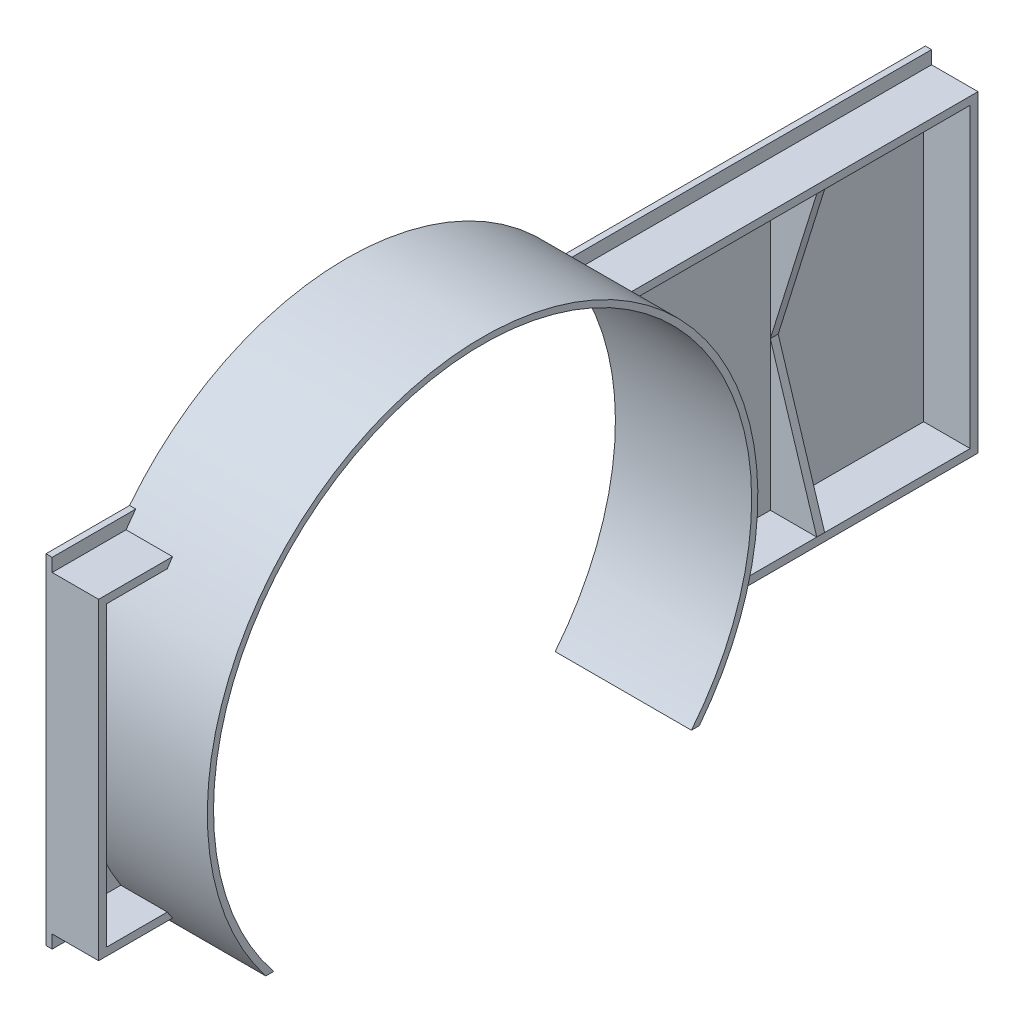
ISO-10303-21;
HEADER;
FILE_DESCRIPTION(('STEP AP214'),'2;1');
FILE_NAME('part.step','',(''),(''),'','','');
FILE_SCHEMA(('AUTOMOTIVE_DESIGN { 1 0 10303 214 1 1 1 1 }'));
ENDSEC;
DATA;
#1=APPLICATION_CONTEXT('core data for automotive mechanical design processes');
#2=APPLICATION_PROTOCOL_DEFINITION('international standard','automotive_design',2000,#1);
#3=PRODUCT_CONTEXT('',#1,'mechanical');
#4=PRODUCT('Part','Part','',(#3));
#5=PRODUCT_RELATED_PRODUCT_CATEGORY('part','',(#4));
#6=PRODUCT_DEFINITION_FORMATION('','',#4);
#7=PRODUCT_DEFINITION_CONTEXT('part definition',#1,'design');
#8=PRODUCT_DEFINITION('design','',#6,#7);
#9=PRODUCT_DEFINITION_SHAPE('','',#8);
#10=(LENGTH_UNIT() NAMED_UNIT(*) SI_UNIT(.MILLI.,.METRE.));
#11=(NAMED_UNIT(*) PLANE_ANGLE_UNIT() SI_UNIT($,.RADIAN.));
#12=(NAMED_UNIT(*) SI_UNIT($,.STERADIAN.) SOLID_ANGLE_UNIT());
#13=UNCERTAINTY_MEASURE_WITH_UNIT(LENGTH_MEASURE(1.E-05),#10,'distance_accuracy_value','');
#14=(GEOMETRIC_REPRESENTATION_CONTEXT(3) GLOBAL_UNCERTAINTY_ASSIGNED_CONTEXT((#13)) GLOBAL_UNIT_ASSIGNED_CONTEXT((#10,
#11,#12)) REPRESENTATION_CONTEXT('',''));
#15=CARTESIAN_POINT('',(0.,0.,0.));
#16=DIRECTION('',(0.,0.,1.));
#17=DIRECTION('',(1.,0.,0.));
#18=AXIS2_PLACEMENT_3D('',#15,#16,#17);
#19=CARTESIAN_POINT('',(0.,0.,0.));
#20=DIRECTION('',(1.,0.,0.));
#21=DIRECTION('',(0.,0.,-1.));
#22=AXIS2_PLACEMENT_3D('',#19,#20,#21);
#23=PLANE('',#22);
#24=DIRECTION('',(0.,0.,-1.));
#25=VECTOR('',#24,1.);
#26=CARTESIAN_POINT('',(0.,102.81000012,122.000000064));
#27=LINE('',#26,#25);
#28=CARTESIAN_POINT('',(0.,102.81000012,119.460000064));
#29=VERTEX_POINT('',#28);
#30=CARTESIAN_POINT('',(0.,102.81000012,99.8214533972538));
#31=VERTEX_POINT('',#30);
#32=EDGE_CURVE('E462',#29,#31,#27,.T.);
#33=ORIENTED_EDGE('',*,*,#32,.F.);
#34=DIRECTION('',(0.,1.,0.));
#35=VECTOR('',#34,1.);
#36=CARTESIAN_POINT('',(0.,102.81000012,119.460000064));
#37=LINE('',#36,#35);
#38=CARTESIAN_POINT('',(0.,6.78999988200613,119.460000064));
#39=VERTEX_POINT('',#38);
#40=EDGE_CURVE('E247',#39,#29,#37,.T.);
#41=ORIENTED_EDGE('',*,*,#40,.F.);
#42=DIRECTION('',(0.,0.,1.));
#43=VECTOR('',#42,1.);
#44=CARTESIAN_POINT('',(0.,6.789999882,99.8214533985529));
#45=LINE('',#44,#43);
#46=CARTESIAN_POINT('',(0.,6.789999882,99.8214533985395));
#47=VERTEX_POINT('',#46);
#48=EDGE_CURVE('E256',#47,#39,#45,.T.);
#49=ORIENTED_EDGE('',*,*,#48,.F.);
#50=CARTESIAN_POINT('',(0.,54.7999999999982,25.));
#51=DIRECTION('',(-1.,0.,0.));
#52=DIRECTION('',(0.,0.,-1.));
#53=AXIS2_PLACEMENT_3D('',#50,#51,#52);
#54=CIRCLE('',#53,88.9);
#55=EDGE_CURVE('E375',#47,#31,#54,.T.);
#56=ORIENTED_EDGE('',*,*,#55,.T.);
#57=EDGE_LOOP('',(#33,#41,#49,#56));
#58=FACE_BOUND('',#57,.T.);
#59=ADVANCED_FACE('F37',(#58),#23,.T.);
#60=CARTESIAN_POINT('',(15.,6.789999882,99.8214533985529));
#61=DIRECTION('',(0.,-1.,0.));
#62=DIRECTION('',(0.,0.,-1.));
#63=AXIS2_PLACEMENT_3D('',#60,#61,#62);
#64=PLANE('',#63);
#65=DIRECTION('',(-1.,0.,0.));
#66=VECTOR('',#65,1.);
#67=CARTESIAN_POINT('',(15.,6.78999988200613,119.460000064));
#68=LINE('',#67,#66);
#69=CARTESIAN_POINT('',(15.,6.78999988200613,119.460000064));
#70=VERTEX_POINT('',#69);
#71=EDGE_CURVE('E242',#70,#39,#68,.T.);
#72=ORIENTED_EDGE('',*,*,#71,.F.);
#73=DIRECTION('',(0.,0.,1.));
#74=VECTOR('',#73,1.);
#75=CARTESIAN_POINT('',(15.,6.789999882,99.8214533985529));
#76=LINE('',#75,#74);
#77=CARTESIAN_POINT('',(15.,6.78999988200613,99.8214533985434));
#78=VERTEX_POINT('',#77);
#79=EDGE_CURVE('E254',#78,#70,#76,.T.);
#80=ORIENTED_EDGE('',*,*,#79,.F.);
#81=DIRECTION('',(-1.,0.,0.));
#82=VECTOR('',#81,1.);
#83=CARTESIAN_POINT('',(15.,6.789999882,99.8214533985529));
#84=LINE('',#83,#82);
#85=EDGE_CURVE('E280',#78,#47,#84,.T.);
#86=ORIENTED_EDGE('',*,*,#85,.T.);
#87=ORIENTED_EDGE('',*,*,#48,.T.);
#88=EDGE_LOOP('',(#72,#80,#86,#87));
#89=FACE_BOUND('',#88,.T.);
#90=ADVANCED_FACE('F252',(#89),#64,.F.);
#91=CARTESIAN_POINT('',(15.,102.81000012,122.000000064));
#92=DIRECTION('',(0.,1.,0.));
#93=DIRECTION('',(0.,0.,1.));
#94=AXIS2_PLACEMENT_3D('',#91,#92,#93);
#95=PLANE('',#94);
#96=DIRECTION('',(-1.,0.,0.));
#97=VECTOR('',#96,1.);
#98=CARTESIAN_POINT('',(15.,102.81000012,119.460000064));
#99=LINE('',#98,#97);
#100=CARTESIAN_POINT('',(15.,102.81000012,119.460000064));
#101=VERTEX_POINT('',#100);
#102=EDGE_CURVE('E54',#101,#29,#99,.T.);
#103=ORIENTED_EDGE('',*,*,#102,.T.);
#104=ORIENTED_EDGE('',*,*,#32,.T.);
#105=DIRECTION('',(-1.,0.,0.));
#106=VECTOR('',#105,1.);
#107=CARTESIAN_POINT('',(15.,102.81000012,99.8214533972538));
#108=LINE('',#107,#106);
#109=CARTESIAN_POINT('',(15.,102.81000012,99.8214533972538));
#110=VERTEX_POINT('',#109);
#111=EDGE_CURVE('E273',#110,#31,#108,.T.);
#112=ORIENTED_EDGE('',*,*,#111,.F.);
#113=DIRECTION('',(0.,0.,-1.));
#114=VECTOR('',#113,1.);
#115=CARTESIAN_POINT('',(15.,102.81000012,122.000000064));
#116=LINE('',#115,#114);
#117=EDGE_CURVE('E488',#101,#110,#116,.T.);
#118=ORIENTED_EDGE('',*,*,#117,.F.);
#119=EDGE_LOOP('',(#103,#104,#112,#118));
#120=FACE_BOUND('',#119,.T.);
#121=ADVANCED_FACE('F490',(#120),#95,.F.);
#122=DIRECTION('',(0.,0.,1.));
#123=VECTOR('',#122,1.);
#124=CARTESIAN_POINT('',(0.,6.789999882,-49.8214533985395));
#125=LINE('',#124,#123);
#126=CARTESIAN_POINT('',(0.,6.789999882,-159.460000064));
#127=VERTEX_POINT('',#126);
#128=CARTESIAN_POINT('',(0.,6.789999882,-112.470000064));
#129=VERTEX_POINT('',#128);
#130=EDGE_CURVE('E287',#127,#129,#125,.T.);
#131=ORIENTED_EDGE('',*,*,#130,.F.);
#132=DIRECTION('',(0.,-1.,0.));
#133=VECTOR('',#132,1.);
#134=CARTESIAN_POINT('',(0.,102.81000012,-159.460000064));
#135=LINE('',#134,#133);
#136=CARTESIAN_POINT('',(0.,102.81000012,-159.460000064));
#137=VERTEX_POINT('',#136);
#138=EDGE_CURVE('E257',#137,#127,#135,.T.);
#139=ORIENTED_EDGE('',*,*,#138,.F.);
#140=DIRECTION('',(0.,0.,-1.));
#141=VECTOR('',#140,1.);
#142=CARTESIAN_POINT('',(0.,102.81000012,-162.000000064));
#143=LINE('',#142,#141);
#144=CARTESIAN_POINT('',(0.,102.81000012,-112.470000064));
#145=VERTEX_POINT('',#144);
#146=EDGE_CURVE('E545',#145,#137,#143,.T.);
#147=ORIENTED_EDGE('',*,*,#146,.F.);
#148=DIRECTION('',(0.,1.,0.));
#149=VECTOR('',#148,1.);
#150=CARTESIAN_POINT('',(0.,0.,-112.470000064));
#151=LINE('',#150,#149);
#152=CARTESIAN_POINT('',(0.,54.800000001,-112.470000064));
#153=VERTEX_POINT('',#152);
#154=EDGE_CURVE('E535',#153,#145,#151,.T.);
#155=ORIENTED_EDGE('',*,*,#154,.F.);
#156=DIRECTION('',(0.,1.,0.));
#157=VECTOR('',#156,1.);
#158=CARTESIAN_POINT('',(0.,0.,-112.470000064));
#159=LINE('',#158,#157);
#160=EDGE_CURVE('E515',#129,#153,#159,.T.);
#161=ORIENTED_EDGE('',*,*,#160,.F.);
#162=EDGE_LOOP('',(#131,#139,#147,#155,#161));
#163=FACE_BOUND('',#162,.T.);
#164=ADVANCED_FACE('F560',(#163),#23,.T.);
#165=CARTESIAN_POINT('',(15.,6.789999882,-49.8214533985395));
#166=DIRECTION('',(0.,-1.,0.));
#167=DIRECTION('',(0.,0.,-1.));
#168=AXIS2_PLACEMENT_3D('',#165,#166,#167);
#169=PLANE('',#168);
#170=DIRECTION('',(-1.,0.,0.));
#171=VECTOR('',#170,1.);
#172=CARTESIAN_POINT('',(15.,6.789999882,-159.460000064));
#173=LINE('',#172,#171);
#174=CARTESIAN_POINT('',(15.,6.789999882,-159.460000064));
#175=VERTEX_POINT('',#174);
#176=EDGE_CURVE('E496',#175,#127,#173,.T.);
#177=ORIENTED_EDGE('',*,*,#176,.T.);
#178=ORIENTED_EDGE('',*,*,#130,.T.);
#179=DIRECTION('',(1.,0.,0.));
#180=VECTOR('',#179,1.);
#181=CARTESIAN_POINT('',(15.,6.789999882,-112.470000064));
#182=LINE('',#181,#180);
#183=CARTESIAN_POINT('',(15.,6.789999882,-112.470000064));
#184=VERTEX_POINT('',#183);
#185=EDGE_CURVE('E512',#129,#184,#182,.T.);
#186=ORIENTED_EDGE('',*,*,#185,.T.);
#187=DIRECTION('',(0.,0.,1.));
#188=VECTOR('',#187,1.);
#189=CARTESIAN_POINT('',(15.,6.789999882,-49.8214533985395));
#190=LINE('',#189,#188);
#191=EDGE_CURVE('E292',#175,#184,#190,.T.);
#192=ORIENTED_EDGE('',*,*,#191,.F.);
#193=EDGE_LOOP('',(#177,#178,#186,#192));
#194=FACE_BOUND('',#193,.T.);
#195=ADVANCED_FACE('F567',(#194),#169,.F.);
#196=CARTESIAN_POINT('',(15.,102.81000012,-162.000000064));
#197=DIRECTION('',(0.,1.,0.));
#198=DIRECTION('',(0.,0.,1.));
#199=AXIS2_PLACEMENT_3D('',#196,#197,#198);
#200=PLANE('',#199);
#201=DIRECTION('',(-1.,0.,0.));
#202=VECTOR('',#201,1.);
#203=CARTESIAN_POINT('',(15.,102.81000012,-159.460000064));
#204=LINE('',#203,#202);
#205=CARTESIAN_POINT('',(15.,102.81000012,-159.460000064));
#206=VERTEX_POINT('',#205);
#207=EDGE_CURVE('E500',#206,#137,#204,.T.);
#208=ORIENTED_EDGE('',*,*,#207,.F.);
#209=DIRECTION('',(0.,0.,-1.));
#210=VECTOR('',#209,1.);
#211=CARTESIAN_POINT('',(15.,102.81000012,-162.000000064));
#212=LINE('',#211,#210);
#213=CARTESIAN_POINT('',(15.,102.81000012,-112.470000064));
#214=VERTEX_POINT('',#213);
#215=EDGE_CURVE('E541',#214,#206,#212,.T.);
#216=ORIENTED_EDGE('',*,*,#215,.F.);
#217=DIRECTION('',(-1.,0.,0.));
#218=VECTOR('',#217,1.);
#219=CARTESIAN_POINT('',(15.,102.81000012,-112.470000064));
#220=LINE('',#219,#218);
#221=EDGE_CURVE('E532',#214,#145,#220,.T.);
#222=ORIENTED_EDGE('',*,*,#221,.T.);
#223=ORIENTED_EDGE('',*,*,#146,.T.);
#224=EDGE_LOOP('',(#208,#216,#222,#223));
#225=FACE_BOUND('',#224,.T.);
#226=ADVANCED_FACE('F553',(#225),#200,.F.);
#227=CARTESIAN_POINT('',(0.,6.789999882,-109.930000064));
#228=VERTEX_POINT('',#227);
#229=CARTESIAN_POINT('',(0.,6.789999882,-49.8214533985395));
#230=VERTEX_POINT('',#229);
#231=EDGE_CURVE('E296',#228,#230,#125,.T.);
#232=ORIENTED_EDGE('',*,*,#231,.F.);
#233=DIRECTION('',(0.,1.,0.));
#234=VECTOR('',#233,1.);
#235=CARTESIAN_POINT('',(0.,0.,-109.930000064));
#236=LINE('',#235,#234);
#237=CARTESIAN_POINT('',(0.,54.8000000010001,-109.930000064));
#238=VERTEX_POINT('',#237);
#239=EDGE_CURVE('E509',#228,#238,#236,.T.);
#240=ORIENTED_EDGE('',*,*,#239,.T.);
#241=DIRECTION('',(0.,1.,0.));
#242=VECTOR('',#241,1.);
#243=CARTESIAN_POINT('',(0.,0.,-109.930000064));
#244=LINE('',#243,#242);
#245=CARTESIAN_POINT('',(0.,102.81000012,-109.930000064));
#246=VERTEX_POINT('',#245);
#247=EDGE_CURVE('E529',#238,#246,#244,.T.);
#248=ORIENTED_EDGE('',*,*,#247,.T.);
#249=CARTESIAN_POINT('',(0.,102.81000012,-49.8214533972539));
#250=VERTEX_POINT('',#249);
#251=EDGE_CURVE('E539',#250,#246,#143,.T.);
#252=ORIENTED_EDGE('',*,*,#251,.F.);
#253=EDGE_CURVE('E376',#250,#230,#54,.T.);
#254=ORIENTED_EDGE('',*,*,#253,.T.);
#255=EDGE_LOOP('',(#232,#240,#248,#252,#254));
#256=FACE_BOUND('',#255,.T.);
#257=ADVANCED_FACE('F589',(#256),#23,.T.);
#258=DIRECTION('',(1.,0.,0.));
#259=VECTOR('',#258,1.);
#260=CARTESIAN_POINT('',(15.,6.789999882,-109.930000064));
#261=LINE('',#260,#259);
#262=CARTESIAN_POINT('',(15.,6.789999882,-109.930000064));
#263=VERTEX_POINT('',#262);
#264=EDGE_CURVE('E505',#228,#263,#261,.T.);
#265=ORIENTED_EDGE('',*,*,#264,.F.);
#266=ORIENTED_EDGE('',*,*,#231,.T.);
#267=DIRECTION('',(-1.,0.,0.));
#268=VECTOR('',#267,1.);
#269=CARTESIAN_POINT('',(15.,6.789999882,-49.8214533985395));
#270=LINE('',#269,#268);
#271=CARTESIAN_POINT('',(15.,6.789999882,-49.8214533985395));
#272=VERTEX_POINT('',#271);
#273=EDGE_CURVE('E294',#272,#230,#270,.T.);
#274=ORIENTED_EDGE('',*,*,#273,.F.);
#275=EDGE_CURVE('E291',#263,#272,#190,.T.);
#276=ORIENTED_EDGE('',*,*,#275,.F.);
#277=EDGE_LOOP('',(#265,#266,#274,#276));
#278=FACE_BOUND('',#277,.T.);
#279=ADVANCED_FACE('F606',(#278),#169,.F.);
#280=DIRECTION('',(-1.,0.,0.));
#281=VECTOR('',#280,1.);
#282=CARTESIAN_POINT('',(15.,102.81000012,-109.930000064));
#283=LINE('',#282,#281);
#284=CARTESIAN_POINT('',(15.,102.81000012,-109.930000064));
#285=VERTEX_POINT('',#284);
#286=EDGE_CURVE('E527',#285,#246,#283,.T.);
#287=ORIENTED_EDGE('',*,*,#286,.F.);
#288=CARTESIAN_POINT('',(15.,102.81000012,-49.8214533972539));
#289=VERTEX_POINT('',#288);
#290=EDGE_CURVE('E484',#289,#285,#212,.T.);
#291=ORIENTED_EDGE('',*,*,#290,.F.);
#292=DIRECTION('',(-1.,0.,0.));
#293=VECTOR('',#292,1.);
#294=CARTESIAN_POINT('',(15.,102.81000012,-49.8214533972539));
#295=LINE('',#294,#293);
#296=EDGE_CURVE('E480',#289,#250,#295,.T.);
#297=ORIENTED_EDGE('',*,*,#296,.T.);
#298=ORIENTED_EDGE('',*,*,#251,.T.);
#299=EDGE_LOOP('',(#287,#291,#297,#298));
#300=FACE_BOUND('',#299,.T.);
#301=ADVANCED_FACE('F593',(#300),#200,.F.);
#302=CARTESIAN_POINT('',(42.000000074,54.7999999999982,25.));
#303=DIRECTION('',(-1.,0.,0.));
#304=DIRECTION('',(0.,0.,1.));
#305=AXIS2_PLACEMENT_3D('',#302,#303,#304);
#306=CYLINDRICAL_SURFACE('',#305,88.9);
#307=CARTESIAN_POINT('',(15.,54.7999999999982,25.));
#308=DIRECTION('',(-1.,0.,0.));
#309=DIRECTION('',(0.,0.,1.));
#310=AXIS2_PLACEMENT_3D('',#307,#308,#309);
#311=CIRCLE('',#310,88.9);
#312=CARTESIAN_POINT('',(15.,105.35000012,-48.1293886742383));
#313=VERTEX_POINT('',#312);
#314=EDGE_CURVE('E476',#313,#289,#311,.T.);
#315=ORIENTED_EDGE('',*,*,#314,.F.);
#316=DIRECTION('',(-1.,0.,0.));
#317=VECTOR('',#316,1.);
#318=CARTESIAN_POINT('',(15.,105.35000012,-48.1293886742384));
#319=LINE('',#318,#317);
#320=CARTESIAN_POINT('',(0.,105.35000012,-48.1293886742384));
#321=VERTEX_POINT('',#320);
#322=EDGE_CURVE('E474',#313,#321,#319,.T.);
#323=ORIENTED_EDGE('',*,*,#322,.T.);
#324=CARTESIAN_POINT('',(0.,109.600000002,-45.0012142736153));
#325=VERTEX_POINT('',#324);
#326=EDGE_CURVE('E377',#325,#321,#54,.T.);
#327=ORIENTED_EDGE('',*,*,#326,.F.);
#328=DIRECTION('',(1.,0.,0.));
#329=VECTOR('',#328,1.);
#330=CARTESIAN_POINT('',(-2.000000064,109.60000000162,-45.0012142746965));
#331=LINE('',#330,#329);
#332=CARTESIAN_POINT('',(-2.000000064,109.60000000162,-45.0012142746965));
#333=VERTEX_POINT('',#332);
#334=EDGE_CURVE('E344',#333,#325,#331,.T.);
#335=ORIENTED_EDGE('',*,*,#334,.F.);
#336=CARTESIAN_POINT('',(-2.000000064,54.7999999999982,25.));
#337=DIRECTION('',(1.,0.,0.));
#338=DIRECTION('',(0.,0.,-1.));
#339=AXIS2_PLACEMENT_3D('',#336,#337,#338);
#340=CIRCLE('',#339,88.9);
#341=CARTESIAN_POINT('',(-2.000000064,109.599999999998,95.0012142751822));
#342=VERTEX_POINT('',#341);
#343=EDGE_CURVE('E306',#333,#342,#340,.T.);
#344=ORIENTED_EDGE('',*,*,#343,.T.);
#345=DIRECTION('',(1.,0.,0.));
#346=VECTOR('',#345,1.);
#347=CARTESIAN_POINT('',(-2.000000064,109.599999999998,95.0012142751822));
#348=LINE('',#347,#346);
#349=CARTESIAN_POINT('',(0.,109.599999999998,95.0012142751821));
#350=VERTEX_POINT('',#349);
#351=EDGE_CURVE('E328',#342,#350,#348,.T.);
#352=ORIENTED_EDGE('',*,*,#351,.T.);
#353=CARTESIAN_POINT('',(0.,105.35000012,98.1293886742383));
#354=VERTEX_POINT('',#353);
#355=EDGE_CURVE('E408',#354,#350,#54,.T.);
#356=ORIENTED_EDGE('',*,*,#355,.F.);
#357=DIRECTION('',(-1.,0.,0.));
#358=VECTOR('',#357,1.);
#359=CARTESIAN_POINT('',(15.,105.35000012,98.1293886742383));
#360=LINE('',#359,#358);
#361=CARTESIAN_POINT('',(15.,105.35000012,98.1293886742383));
#362=VERTEX_POINT('',#361);
#363=EDGE_CURVE('E450',#362,#354,#360,.T.);
#364=ORIENTED_EDGE('',*,*,#363,.F.);
#365=CARTESIAN_POINT('',(15.,54.7999999999982,25.));
#366=DIRECTION('',(-1.,0.,0.));
#367=DIRECTION('',(0.,0.,-1.));
#368=AXIS2_PLACEMENT_3D('',#365,#366,#367);
#369=CIRCLE('',#368,88.9);
#370=EDGE_CURVE('E443',#110,#362,#369,.T.);
#371=ORIENTED_EDGE('',*,*,#370,.F.);
#372=ORIENTED_EDGE('',*,*,#111,.T.);
#373=ORIENTED_EDGE('',*,*,#55,.F.);
#374=ORIENTED_EDGE('',*,*,#85,.F.);
#375=CARTESIAN_POINT('',(15.,54.8000000109421,24.9999999841677));
#376=DIRECTION('',(-1.,0.,0.));
#377=DIRECTION('',(0.,0.,-1.));
#378=AXIS2_PLACEMENT_3D('',#375,#376,#377);
#379=CIRCLE('',#378,88.9000000192466);
#380=CARTESIAN_POINT('',(15.,4.249999882,98.1293886756233));
#381=VERTEX_POINT('',#380);
#382=EDGE_CURVE('E261',#381,#78,#379,.T.);
#383=ORIENTED_EDGE('',*,*,#382,.F.);
#384=DIRECTION('',(-1.,0.,0.));
#385=VECTOR('',#384,1.);
#386=CARTESIAN_POINT('',(15.,4.249999882,98.1293886756233));
#387=LINE('',#386,#385);
#388=CARTESIAN_POINT('',(0.,4.249999882,98.1293886756233));
#389=VERTEX_POINT('',#388);
#390=EDGE_CURVE('E271',#381,#389,#387,.T.);
#391=ORIENTED_EDGE('',*,*,#390,.T.);
#392=CARTESIAN_POINT('',(0.,0.,95.0012142751838));
#393=VERTEX_POINT('',#392);
#394=EDGE_CURVE('E365',#393,#389,#54,.T.);
#395=ORIENTED_EDGE('',*,*,#394,.F.);
#396=DIRECTION('',(-1.,0.,0.));
#397=VECTOR('',#396,1.);
#398=CARTESIAN_POINT('',(42.000000074,0.,95.0012142751838));
#399=LINE('',#398,#397);
#400=CARTESIAN_POINT('',(42.000000074,0.,95.0012142751838));
#401=VERTEX_POINT('',#400);
#402=EDGE_CURVE('E380',#401,#393,#399,.T.);
#403=ORIENTED_EDGE('',*,*,#402,.F.);
#404=CARTESIAN_POINT('',(42.000000074,54.7999999999982,25.));
#405=DIRECTION('',(-1.,0.,0.));
#406=DIRECTION('',(0.,0.,-1.));
#407=AXIS2_PLACEMENT_3D('',#404,#405,#406);
#408=CIRCLE('',#407,88.9);
#409=CARTESIAN_POINT('',(42.000000074,0.,-45.0012142751838));
#410=VERTEX_POINT('',#409);
#411=EDGE_CURVE('E368',#401,#410,#408,.T.);
#412=ORIENTED_EDGE('',*,*,#411,.T.);
#413=DIRECTION('',(-1.,0.,0.));
#414=VECTOR('',#413,1.);
#415=CARTESIAN_POINT('',(42.000000074,0.,-45.0012142751838));
#416=LINE('',#415,#414);
#417=CARTESIAN_POINT('',(0.,0.,-45.0012142751838));
#418=VERTEX_POINT('',#417);
#419=EDGE_CURVE('E46',#410,#418,#416,.T.);
#420=ORIENTED_EDGE('',*,*,#419,.T.);
#421=CARTESIAN_POINT('',(0.,4.249999882,-48.1293886756233));
#422=VERTEX_POINT('',#421);
#423=EDGE_CURVE('E347',#422,#418,#54,.T.);
#424=ORIENTED_EDGE('',*,*,#423,.F.);
#425=DIRECTION('',(-1.,0.,0.));
#426=VECTOR('',#425,1.);
#427=CARTESIAN_POINT('',(15.,4.249999882,-48.1293886756233));
#428=LINE('',#427,#426);
#429=CARTESIAN_POINT('',(15.,4.249999882,-48.1293886756233));
#430=VERTEX_POINT('',#429);
#431=EDGE_CURVE('E303',#430,#422,#428,.T.);
#432=ORIENTED_EDGE('',*,*,#431,.F.);
#433=CARTESIAN_POINT('',(15.,54.7999999999982,25.));
#434=DIRECTION('',(-1.,0.,0.));
#435=DIRECTION('',(0.,0.,1.));
#436=AXIS2_PLACEMENT_3D('',#433,#434,#435);
#437=CIRCLE('',#436,88.9);
#438=EDGE_CURVE('E283',#272,#430,#437,.T.);
#439=ORIENTED_EDGE('',*,*,#438,.F.);
#440=ORIENTED_EDGE('',*,*,#273,.T.);
#441=ORIENTED_EDGE('',*,*,#253,.F.);
#442=ORIENTED_EDGE('',*,*,#296,.F.);
#443=EDGE_LOOP('',(#315,#323,#327,#335,#344,#352,#356,#364,#371,#372,#373,#374,#383,#391,#395,
#403,#412,#420,#424,#432,#439,#440,#441,#442));
#444=FACE_BOUND('',#443,.T.);
#445=ADVANCED_FACE('F407',(#444),#306,.T.);
#446=DIRECTION('',(0.,0.,1.));
#447=VECTOR('',#446,1.);
#448=CARTESIAN_POINT('',(0.,109.600000002,0.));
#449=LINE('',#448,#447);
#450=CARTESIAN_POINT('',(0.,109.600000002,-162.000000064));
#451=VERTEX_POINT('',#450);
#452=EDGE_CURVE('E310',#451,#325,#449,.T.);
#453=ORIENTED_EDGE('',*,*,#452,.T.);
#454=ORIENTED_EDGE('',*,*,#326,.T.);
#455=DIRECTION('',(0.,0.,1.));
#456=VECTOR('',#455,1.);
#457=CARTESIAN_POINT('',(0.,105.35000012,-162.000000064));
#458=LINE('',#457,#456);
#459=CARTESIAN_POINT('',(0.,105.35000012,-162.000000064));
#460=VERTEX_POINT('',#459);
#461=EDGE_CURVE('E470',#460,#321,#458,.T.);
#462=ORIENTED_EDGE('',*,*,#461,.F.);
#463=DIRECTION('',(0.,1.,0.));
#464=VECTOR('',#463,1.);
#465=CARTESIAN_POINT('',(0.,0.,-162.000000064));
#466=LINE('',#465,#464);
#467=EDGE_CURVE('E339',#460,#451,#466,.T.);
#468=ORIENTED_EDGE('',*,*,#467,.T.);
#469=EDGE_LOOP('',(#453,#454,#462,#468));
#470=FACE_BOUND('',#469,.T.);
#471=ADVANCED_FACE('F469',(#470),#23,.T.);
#472=DIRECTION('',(0.,-1.,0.));
#473=VECTOR('',#472,1.);
#474=CARTESIAN_POINT('',(0.,0.,122.000000064));
#475=LINE('',#474,#473);
#476=CARTESIAN_POINT('',(0.,109.599999999999,122.000000064));
#477=VERTEX_POINT('',#476);
#478=CARTESIAN_POINT('',(0.,105.35000012,122.000000064));
#479=VERTEX_POINT('',#478);
#480=EDGE_CURVE('E332',#477,#479,#475,.T.);
#481=ORIENTED_EDGE('',*,*,#480,.T.);
#482=DIRECTION('',(0.,0.,1.));
#483=VECTOR('',#482,1.);
#484=CARTESIAN_POINT('',(0.,105.35000012,122.000000064));
#485=LINE('',#484,#483);
#486=EDGE_CURVE('E449',#354,#479,#485,.T.);
#487=ORIENTED_EDGE('',*,*,#486,.F.);
#488=ORIENTED_EDGE('',*,*,#355,.T.);
#489=DIRECTION('',(0.,0.,1.));
#490=VECTOR('',#489,1.);
#491=CARTESIAN_POINT('',(0.,109.6,1.27770671624085E-12));
#492=LINE('',#491,#490);
#493=EDGE_CURVE('E305',#350,#477,#492,.T.);
#494=ORIENTED_EDGE('',*,*,#493,.T.);
#495=EDGE_LOOP('',(#481,#487,#488,#494));
#496=FACE_BOUND('',#495,.T.);
#497=ADVANCED_FACE('F632',(#496),#23,.T.);
#498=ORIENTED_EDGE('',*,*,#394,.T.);
#499=DIRECTION('',(0.,0.,-1.));
#500=VECTOR('',#499,1.);
#501=CARTESIAN_POINT('',(0.,4.249999882,122.000000064));
#502=LINE('',#501,#500);
#503=CARTESIAN_POINT('',(0.,4.249999882,122.000000064));
#504=VERTEX_POINT('',#503);
#505=EDGE_CURVE('E266',#504,#389,#502,.T.);
#506=ORIENTED_EDGE('',*,*,#505,.F.);
#507=CARTESIAN_POINT('',(0.,-1.04744440334534E-12,122.000000064));
#508=VERTEX_POINT('',#507);
#509=EDGE_CURVE('E331',#504,#508,#475,.T.);
#510=ORIENTED_EDGE('',*,*,#509,.T.);
#511=DIRECTION('',(0.,-7.106723131739E-13,1.));
#512=VECTOR('',#511,1.);
#513=CARTESIAN_POINT('',(0.,6.56898036065456E-11,0.));
#514=LINE('',#513,#512);
#515=EDGE_CURVE('E334',#393,#508,#514,.T.);
#516=ORIENTED_EDGE('',*,*,#515,.F.);
#517=EDGE_LOOP('',(#498,#506,#510,#516));
#518=FACE_BOUND('',#517,.T.);
#519=ADVANCED_FACE('F431',(#518),#23,.T.);
#520=CARTESIAN_POINT('',(0.,0.,-162.000000064));
#521=VERTEX_POINT('',#520);
#522=CARTESIAN_POINT('',(0.,4.249999882,-162.000000064));
#523=VERTEX_POINT('',#522);
#524=EDGE_CURVE('E340',#521,#523,#466,.T.);
#525=ORIENTED_EDGE('',*,*,#524,.T.);
#526=DIRECTION('',(0.,0.,-1.));
#527=VECTOR('',#526,1.);
#528=CARTESIAN_POINT('',(0.,4.249999882,-48.1293886756233));
#529=LINE('',#528,#527);
#530=EDGE_CURVE('E282',#422,#523,#529,.T.);
#531=ORIENTED_EDGE('',*,*,#530,.F.);
#532=ORIENTED_EDGE('',*,*,#423,.T.);
#533=DIRECTION('',(0.,0.,-1.));
#534=VECTOR('',#533,1.);
#535=CARTESIAN_POINT('',(0.,0.,0.));
#536=LINE('',#535,#534);
#537=EDGE_CURVE('E337',#418,#521,#536,.T.);
#538=ORIENTED_EDGE('',*,*,#537,.T.);
#539=EDGE_LOOP('',(#525,#531,#532,#538));
#540=FACE_BOUND('',#539,.T.);
#541=ADVANCED_FACE('F600',(#540),#23,.T.);
#542=CARTESIAN_POINT('',(42.000000074,54.7999999999982,25.));
#543=DIRECTION('',(-1.,0.,0.));
#544=DIRECTION('',(0.,0.,1.));
#545=AXIS2_PLACEMENT_3D('',#542,#543,#544);
#546=CYLINDRICAL_SURFACE('',#545,86.899999936);
#547=DIRECTION('',(-1.,0.,0.));
#548=VECTOR('',#547,1.);
#549=CARTESIAN_POINT('',(42.000000074,0.,92.4430870354923));
#550=LINE('',#549,#548);
#551=CARTESIAN_POINT('',(42.000000074,0.,92.4430870354923));
#552=VERTEX_POINT('',#551);
#553=CARTESIAN_POINT('',(-2.000000064,0.,92.4430870354923));
#554=VERTEX_POINT('',#553);
#555=EDGE_CURVE('E41',#552,#554,#550,.T.);
#556=ORIENTED_EDGE('',*,*,#555,.T.);
#557=CARTESIAN_POINT('',(-2.000000064,54.7999999999982,25.));
#558=DIRECTION('',(1.,0.,0.));
#559=DIRECTION('',(0.,0.,-1.));
#560=AXIS2_PLACEMENT_3D('',#557,#558,#559);
#561=CIRCLE('',#560,86.899999936);
#562=CARTESIAN_POINT('',(-2.000000064,0.,-42.4430870354924));
#563=VERTEX_POINT('',#562);
#564=EDGE_CURVE('E318',#563,#554,#561,.T.);
#565=ORIENTED_EDGE('',*,*,#564,.F.);
#566=DIRECTION('',(-1.,0.,0.));
#567=VECTOR('',#566,1.);
#568=CARTESIAN_POINT('',(42.000000074,0.,-42.4430870354924));
#569=LINE('',#568,#567);
#570=CARTESIAN_POINT('',(42.000000074,0.,-42.4430870354924));
#571=VERTEX_POINT('',#570);
#572=EDGE_CURVE('E11',#571,#563,#569,.T.);
#573=ORIENTED_EDGE('',*,*,#572,.F.);
#574=CARTESIAN_POINT('',(42.000000074,54.7999999999982,25.));
#575=DIRECTION('',(1.,0.,0.));
#576=DIRECTION('',(0.,0.,-1.));
#577=AXIS2_PLACEMENT_3D('',#574,#575,#576);
#578=CIRCLE('',#577,86.899999936);
#579=EDGE_CURVE('E361',#571,#552,#578,.T.);
#580=ORIENTED_EDGE('',*,*,#579,.T.);
#581=EDGE_LOOP('',(#556,#565,#573,#580));
#582=FACE_BOUND('',#581,.T.);
#583=ADVANCED_FACE('F39',(#582),#546,.F.);
#584=CARTESIAN_POINT('',(42.000000074,0.,-45.0012142751838));
#585=DIRECTION('',(0.,-1.,0.));
#586=DIRECTION('',(0.,0.,-1.));
#587=AXIS2_PLACEMENT_3D('',#584,#585,#586);
#588=PLANE('',#587);
#589=DIRECTION('',(1.,0.,0.));
#590=VECTOR('',#589,1.);
#591=CARTESIAN_POINT('',(-2.000000064,0.,-162.000000064));
#592=LINE('',#591,#590);
#593=CARTESIAN_POINT('',(-2.000000064,0.,-162.000000064));
#594=VERTEX_POINT('',#593);
#595=EDGE_CURVE('E351',#594,#521,#592,.T.);
#596=ORIENTED_EDGE('',*,*,#595,.T.);
#597=ORIENTED_EDGE('',*,*,#537,.F.);
#598=ORIENTED_EDGE('',*,*,#419,.F.);
#599=DIRECTION('',(0.,0.,1.));
#600=VECTOR('',#599,1.);
#601=CARTESIAN_POINT('',(42.000000074,0.,-45.0012142751838));
#602=LINE('',#601,#600);
#603=EDGE_CURVE('E371',#410,#571,#602,.T.);
#604=ORIENTED_EDGE('',*,*,#603,.T.);
#605=ORIENTED_EDGE('',*,*,#572,.T.);
#606=DIRECTION('',(0.,0.,-1.));
#607=VECTOR('',#606,1.);
#608=CARTESIAN_POINT('',(-2.000000064,0.,0.));
#609=LINE('',#608,#607);
#610=EDGE_CURVE('E321',#563,#594,#609,.T.);
#611=ORIENTED_EDGE('',*,*,#610,.T.);
#612=EDGE_LOOP('',(#596,#597,#598,#604,#605,#611));
#613=FACE_BOUND('',#612,.T.);
#614=ADVANCED_FACE('F422',(#613),#588,.T.);
#615=CARTESIAN_POINT('',(42.000000074,0.,92.4430870354923));
#616=DIRECTION('',(0.,-1.,0.));
#617=DIRECTION('',(0.,0.,-1.));
#618=AXIS2_PLACEMENT_3D('',#615,#616,#617);
#619=PLANE('',#618);
#620=ORIENTED_EDGE('',*,*,#402,.T.);
#621=ORIENTED_EDGE('',*,*,#515,.T.);
#622=DIRECTION('',(1.,0.,0.));
#623=VECTOR('',#622,1.);
#624=CARTESIAN_POINT('',(-2.000000064,-1.04744440334534E-12,122.000000064));
#625=LINE('',#624,#623);
#626=CARTESIAN_POINT('',(-2.000000064,-1.04744440334534E-12,122.000000064));
#627=VERTEX_POINT('',#626);
#628=EDGE_CURVE('E354',#627,#508,#625,.T.);
#629=ORIENTED_EDGE('',*,*,#628,.F.);
#630=DIRECTION('',(0.,-7.106723131739E-13,1.));
#631=VECTOR('',#630,1.);
#632=CARTESIAN_POINT('',(-2.000000064,6.56898036065456E-11,0.));
#633=LINE('',#632,#631);
#634=EDGE_CURVE('E316',#554,#627,#633,.T.);
#635=ORIENTED_EDGE('',*,*,#634,.F.);
#636=ORIENTED_EDGE('',*,*,#555,.F.);
#637=DIRECTION('',(0.,0.,1.));
#638=VECTOR('',#637,1.);
#639=CARTESIAN_POINT('',(42.000000074,0.,92.4430870354923));
#640=LINE('',#639,#638);
#641=EDGE_CURVE('E364',#552,#401,#640,.T.);
#642=ORIENTED_EDGE('',*,*,#641,.T.);
#643=EDGE_LOOP('',(#620,#621,#629,#635,#636,#642));
#644=FACE_BOUND('',#643,.T.);
#645=ADVANCED_FACE('F394',(#644),#619,.T.);
#646=CARTESIAN_POINT('',(42.000000074,54.7999999999982,25.));
#647=DIRECTION('',(1.,0.,0.));
#648=DIRECTION('',(0.,0.,-1.));
#649=AXIS2_PLACEMENT_3D('',#646,#647,#648);
#650=PLANE('',#649);
#651=ORIENTED_EDGE('',*,*,#579,.F.);
#652=ORIENTED_EDGE('',*,*,#603,.F.);
#653=ORIENTED_EDGE('',*,*,#411,.F.);
#654=ORIENTED_EDGE('',*,*,#641,.F.);
#655=EDGE_LOOP('',(#651,#652,#653,#654));
#656=FACE_BOUND('',#655,.T.);
#657=ADVANCED_FACE('F425',(#656),#650,.T.);
#658=CARTESIAN_POINT('',(-2.000000064,109.600000002,0.));
#659=DIRECTION('',(0.,1.,0.));
#660=DIRECTION('',(0.,0.,1.));
#661=AXIS2_PLACEMENT_3D('',#658,#659,#660);
#662=PLANE('',#661);
#663=DIRECTION('',(0.,0.,1.));
#664=VECTOR('',#663,1.);
#665=CARTESIAN_POINT('',(-2.000000064,109.600000002,0.));
#666=LINE('',#665,#664);
#667=CARTESIAN_POINT('',(-2.000000064,109.600000002,-162.000000064));
#668=VERTEX_POINT('',#667);
#669=EDGE_CURVE('E326',#668,#333,#666,.T.);
#670=ORIENTED_EDGE('',*,*,#669,.T.);
#671=ORIENTED_EDGE('',*,*,#334,.T.);
#672=ORIENTED_EDGE('',*,*,#452,.F.);
#673=DIRECTION('',(1.,0.,0.));
#674=VECTOR('',#673,1.);
#675=CARTESIAN_POINT('',(-2.000000064,109.600000002,-162.000000064));
#676=LINE('',#675,#674);
#677=EDGE_CURVE('E348',#668,#451,#676,.T.);
#678=ORIENTED_EDGE('',*,*,#677,.F.);
#679=EDGE_LOOP('',(#670,#671,#672,#678));
#680=FACE_BOUND('',#679,.T.);
#681=ADVANCED_FACE('F414',(#680),#662,.T.);
#682=CARTESIAN_POINT('',(-2.000000064,0.,-162.000000064));
#683=DIRECTION('',(0.,0.,-1.));
#684=DIRECTION('',(-1.,0.,0.));
#685=AXIS2_PLACEMENT_3D('',#682,#683,#684);
#686=PLANE('',#685);
#687=ORIENTED_EDGE('',*,*,#524,.F.);
#688=ORIENTED_EDGE('',*,*,#595,.F.);
#689=DIRECTION('',(0.,1.,0.));
#690=VECTOR('',#689,1.);
#691=CARTESIAN_POINT('',(-2.000000064,0.,-162.000000064));
#692=LINE('',#691,#690);
#693=EDGE_CURVE('E323',#594,#668,#692,.T.);
#694=ORIENTED_EDGE('',*,*,#693,.T.);
#695=ORIENTED_EDGE('',*,*,#677,.T.);
#696=ORIENTED_EDGE('',*,*,#467,.F.);
#697=DIRECTION('',(-1.,0.,0.));
#698=VECTOR('',#697,1.);
#699=CARTESIAN_POINT('',(15.,105.35000012,-162.000000064));
#700=LINE('',#699,#698);
#701=CARTESIAN_POINT('',(15.,105.35000012,-162.000000064));
#702=VERTEX_POINT('',#701);
#703=EDGE_CURVE('E479',#702,#460,#700,.T.);
#704=ORIENTED_EDGE('',*,*,#703,.F.);
#705=DIRECTION('',(0.,1.,0.));
#706=VECTOR('',#705,1.);
#707=CARTESIAN_POINT('',(15.,6.789999882,-162.000000064));
#708=LINE('',#707,#706);
#709=CARTESIAN_POINT('',(15.,4.249999882,-162.000000064));
#710=VERTEX_POINT('',#709);
#711=EDGE_CURVE('E289',#710,#702,#708,.T.);
#712=ORIENTED_EDGE('',*,*,#711,.F.);
#713=DIRECTION('',(-1.,0.,0.));
#714=VECTOR('',#713,1.);
#715=CARTESIAN_POINT('',(15.,4.249999882,-162.000000064));
#716=LINE('',#715,#714);
#717=EDGE_CURVE('E300',#710,#523,#716,.T.);
#718=ORIENTED_EDGE('',*,*,#717,.T.);
#719=EDGE_LOOP('',(#687,#688,#694,#695,#696,#704,#712,#718));
#720=FACE_BOUND('',#719,.T.);
#721=ADVANCED_FACE('F419',(#720),#686,.T.);
#722=CARTESIAN_POINT('',(-2.000000064,0.,122.000000064));
#723=DIRECTION('',(0.,0.,1.));
#724=DIRECTION('',(0.,-1.,0.));
#725=AXIS2_PLACEMENT_3D('',#722,#723,#724);
#726=PLANE('',#725);
#727=ORIENTED_EDGE('',*,*,#480,.F.);
#728=DIRECTION('',(1.,0.,0.));
#729=VECTOR('',#728,1.);
#730=CARTESIAN_POINT('',(-2.000000064,109.599999999999,122.000000064));
#731=LINE('',#730,#729);
#732=CARTESIAN_POINT('',(-2.000000064,109.599999999999,122.000000064));
#733=VERTEX_POINT('',#732);
#734=EDGE_CURVE('E357',#733,#477,#731,.T.);
#735=ORIENTED_EDGE('',*,*,#734,.F.);
#736=DIRECTION('',(0.,-1.,0.));
#737=VECTOR('',#736,1.);
#738=CARTESIAN_POINT('',(-2.000000064,0.,122.000000064));
#739=LINE('',#738,#737);
#740=EDGE_CURVE('E313',#733,#627,#739,.T.);
#741=ORIENTED_EDGE('',*,*,#740,.T.);
#742=ORIENTED_EDGE('',*,*,#628,.T.);
#743=ORIENTED_EDGE('',*,*,#509,.F.);
#744=DIRECTION('',(-1.,0.,0.));
#745=VECTOR('',#744,1.);
#746=CARTESIAN_POINT('',(15.,4.249999882,122.000000064));
#747=LINE('',#746,#745);
#748=CARTESIAN_POINT('',(15.,4.249999882,122.000000064));
#749=VERTEX_POINT('',#748);
#750=EDGE_CURVE('E277',#749,#504,#747,.T.);
#751=ORIENTED_EDGE('',*,*,#750,.F.);
#752=DIRECTION('',(0.,-1.,0.));
#753=VECTOR('',#752,1.);
#754=CARTESIAN_POINT('',(15.,6.789999882,122.000000064));
#755=LINE('',#754,#753);
#756=CARTESIAN_POINT('',(15.,105.35000012,122.000000064));
#757=VERTEX_POINT('',#756);
#758=EDGE_CURVE('E262',#757,#749,#755,.T.);
#759=ORIENTED_EDGE('',*,*,#758,.F.);
#760=DIRECTION('',(-1.,0.,0.));
#761=VECTOR('',#760,1.);
#762=CARTESIAN_POINT('',(15.,105.35000012,122.000000064));
#763=LINE('',#762,#761);
#764=EDGE_CURVE('E445',#757,#479,#763,.T.);
#765=ORIENTED_EDGE('',*,*,#764,.T.);
#766=EDGE_LOOP('',(#727,#735,#741,#742,#743,#751,#759,#765));
#767=FACE_BOUND('',#766,.T.);
#768=ADVANCED_FACE('F398',(#767),#726,.T.);
#769=CARTESIAN_POINT('',(-2.000000064,109.6,1.27770671624085E-12));
#770=DIRECTION('',(0.,1.,0.));
#771=DIRECTION('',(0.,0.,1.));
#772=AXIS2_PLACEMENT_3D('',#769,#770,#771);
#773=PLANE('',#772);
#774=ORIENTED_EDGE('',*,*,#493,.F.);
#775=ORIENTED_EDGE('',*,*,#351,.F.);
#776=DIRECTION('',(0.,0.,1.));
#777=VECTOR('',#776,1.);
#778=CARTESIAN_POINT('',(-2.000000064,109.6,1.27770671624085E-12));
#779=LINE('',#778,#777);
#780=EDGE_CURVE('E309',#342,#733,#779,.T.);
#781=ORIENTED_EDGE('',*,*,#780,.T.);
#782=ORIENTED_EDGE('',*,*,#734,.T.);
#783=EDGE_LOOP('',(#774,#775,#781,#782));
#784=FACE_BOUND('',#783,.T.);
#785=ADVANCED_FACE('F403',(#784),#773,.T.);
#786=CARTESIAN_POINT('',(-2.000000064,0.,0.));
#787=DIRECTION('',(1.,0.,0.));
#788=DIRECTION('',(0.,0.,-1.));
#789=AXIS2_PLACEMENT_3D('',#786,#787,#788);
#790=PLANE('',#789);
#791=ORIENTED_EDGE('',*,*,#693,.F.);
#792=ORIENTED_EDGE('',*,*,#610,.F.);
#793=ORIENTED_EDGE('',*,*,#564,.T.);
#794=ORIENTED_EDGE('',*,*,#634,.T.);
#795=ORIENTED_EDGE('',*,*,#740,.F.);
#796=ORIENTED_EDGE('',*,*,#780,.F.);
#797=ORIENTED_EDGE('',*,*,#343,.F.);
#798=ORIENTED_EDGE('',*,*,#669,.F.);
#799=EDGE_LOOP('',(#791,#792,#793,#794,#795,#796,#797,#798));
#800=FACE_BOUND('',#799,.T.);
#801=ADVANCED_FACE('F391',(#800),#790,.F.);
#802=CARTESIAN_POINT('',(15.,4.249999882,-48.1293886756233));
#803=DIRECTION('',(0.,1.,0.));
#804=DIRECTION('',(0.,0.,1.));
#805=AXIS2_PLACEMENT_3D('',#802,#803,#804);
#806=PLANE('',#805);
#807=ORIENTED_EDGE('',*,*,#717,.F.);
#808=DIRECTION('',(0.,0.,-1.));
#809=VECTOR('',#808,1.);
#810=CARTESIAN_POINT('',(15.,4.249999882,-48.1293886756233));
#811=LINE('',#810,#809);
#812=EDGE_CURVE('E286',#430,#710,#811,.T.);
#813=ORIENTED_EDGE('',*,*,#812,.F.);
#814=ORIENTED_EDGE('',*,*,#431,.T.);
#815=ORIENTED_EDGE('',*,*,#530,.T.);
#816=EDGE_LOOP('',(#807,#813,#814,#815));
#817=FACE_BOUND('',#816,.T.);
#818=ADVANCED_FACE('F603',(#817),#806,.F.);
#819=CARTESIAN_POINT('',(15.,54.7999999999982,25.));
#820=DIRECTION('',(-1.,0.,0.));
#821=DIRECTION('',(0.,0.,1.));
#822=AXIS2_PLACEMENT_3D('',#819,#820,#821);
#823=PLANE('',#822);
#824=ORIENTED_EDGE('',*,*,#711,.T.);
#825=DIRECTION('',(0.,0.,1.));
#826=VECTOR('',#825,1.);
#827=CARTESIAN_POINT('',(15.,105.35000012,-162.000000064));
#828=LINE('',#827,#826);
#829=EDGE_CURVE('E537',#702,#313,#828,.T.);
#830=ORIENTED_EDGE('',*,*,#829,.T.);
#831=ORIENTED_EDGE('',*,*,#314,.T.);
#832=ORIENTED_EDGE('',*,*,#290,.T.);
#833=EDGE_CURVE('E544',#285,#214,#212,.T.);
#834=ORIENTED_EDGE('',*,*,#833,.T.);
#835=ORIENTED_EDGE('',*,*,#215,.T.);
#836=DIRECTION('',(0.,-1.,0.));
#837=VECTOR('',#836,1.);
#838=CARTESIAN_POINT('',(15.,102.81000012,-159.460000064));
#839=LINE('',#838,#837);
#840=EDGE_CURVE('E494',#206,#175,#839,.T.);
#841=ORIENTED_EDGE('',*,*,#840,.T.);
#842=ORIENTED_EDGE('',*,*,#191,.T.);
#843=DIRECTION('',(0.,0.,1.));
#844=VECTOR('',#843,1.);
#845=CARTESIAN_POINT('',(15.,6.789999882,25.));
#846=LINE('',#845,#844);
#847=EDGE_CURVE('E518',#263,#184,#846,.F.);
#848=ORIENTED_EDGE('',*,*,#847,.F.);
#849=ORIENTED_EDGE('',*,*,#275,.T.);
#850=ORIENTED_EDGE('',*,*,#438,.T.);
#851=ORIENTED_EDGE('',*,*,#812,.T.);
#852=EDGE_LOOP('',(#824,#830,#831,#832,#834,#835,#841,#842,#848,#849,#850,#851));
#853=FACE_BOUND('',#852,.T.);
#854=ADVANCED_FACE('F571',(#853),#823,.F.);
#855=CARTESIAN_POINT('',(15.,4.249999882,122.000000064));
#856=DIRECTION('',(0.,1.,0.));
#857=DIRECTION('',(0.,0.,1.));
#858=AXIS2_PLACEMENT_3D('',#855,#856,#857);
#859=PLANE('',#858);
#860=ORIENTED_EDGE('',*,*,#505,.T.);
#861=ORIENTED_EDGE('',*,*,#390,.F.);
#862=DIRECTION('',(0.,0.,-1.));
#863=VECTOR('',#862,1.);
#864=CARTESIAN_POINT('',(15.,4.249999882,122.000000064));
#865=LINE('',#864,#863);
#866=EDGE_CURVE('E264',#749,#381,#865,.T.);
#867=ORIENTED_EDGE('',*,*,#866,.F.);
#868=ORIENTED_EDGE('',*,*,#750,.T.);
#869=EDGE_LOOP('',(#860,#861,#867,#868));
#870=FACE_BOUND('',#869,.T.);
#871=ADVANCED_FACE('F437',(#870),#859,.F.);
#872=CARTESIAN_POINT('',(15.,54.8000000109421,24.9999999841677));
#873=DIRECTION('',(1.,0.,0.));
#874=DIRECTION('',(0.,0.,-1.));
#875=AXIS2_PLACEMENT_3D('',#872,#873,#874);
#876=PLANE('',#875);
#877=ORIENTED_EDGE('',*,*,#382,.T.);
#878=ORIENTED_EDGE('',*,*,#79,.T.);
#879=DIRECTION('',(0.,1.,0.));
#880=VECTOR('',#879,1.);
#881=CARTESIAN_POINT('',(15.,102.81000012,119.460000064));
#882=LINE('',#881,#880);
#883=EDGE_CURVE('E239',#70,#101,#882,.T.);
#884=ORIENTED_EDGE('',*,*,#883,.T.);
#885=ORIENTED_EDGE('',*,*,#117,.T.);
#886=ORIENTED_EDGE('',*,*,#370,.T.);
#887=DIRECTION('',(0.,0.,1.));
#888=VECTOR('',#887,1.);
#889=CARTESIAN_POINT('',(15.,105.35000012,122.000000064));
#890=LINE('',#889,#888);
#891=EDGE_CURVE('E440',#362,#757,#890,.T.);
#892=ORIENTED_EDGE('',*,*,#891,.T.);
#893=ORIENTED_EDGE('',*,*,#758,.T.);
#894=ORIENTED_EDGE('',*,*,#866,.T.);
#895=EDGE_LOOP('',(#877,#878,#884,#885,#886,#892,#893,#894));
#896=FACE_BOUND('',#895,.T.);
#897=ADVANCED_FACE('F259',(#896),#876,.T.);
#898=CARTESIAN_POINT('',(15.,105.35000012,122.000000064));
#899=DIRECTION('',(0.,-1.,0.));
#900=DIRECTION('',(0.,0.,-1.));
#901=AXIS2_PLACEMENT_3D('',#898,#899,#900);
#902=PLANE('',#901);
#903=ORIENTED_EDGE('',*,*,#486,.T.);
#904=ORIENTED_EDGE('',*,*,#764,.F.);
#905=ORIENTED_EDGE('',*,*,#891,.F.);
#906=ORIENTED_EDGE('',*,*,#363,.T.);
#907=EDGE_LOOP('',(#903,#904,#905,#906));
#908=FACE_BOUND('',#907,.T.);
#909=ADVANCED_FACE('F448',(#908),#902,.F.);
#910=CARTESIAN_POINT('',(15.,105.35000012,-162.000000064));
#911=DIRECTION('',(0.,-1.,0.));
#912=DIRECTION('',(0.,0.,-1.));
#913=AXIS2_PLACEMENT_3D('',#910,#911,#912);
#914=PLANE('',#913);
#915=ORIENTED_EDGE('',*,*,#461,.T.);
#916=ORIENTED_EDGE('',*,*,#322,.F.);
#917=ORIENTED_EDGE('',*,*,#829,.F.);
#918=ORIENTED_EDGE('',*,*,#703,.T.);
#919=EDGE_LOOP('',(#915,#916,#917,#918));
#920=FACE_BOUND('',#919,.T.);
#921=ADVANCED_FACE('F597',(#920),#914,.F.);
#922=CARTESIAN_POINT('',(15.,102.81000012,-111.200000064));
#923=DIRECTION('',(0.954497664490748,-0.298218390582654,0.));
#924=DIRECTION('',(-0.298218390582654,-0.954497664490747,0.));
#925=AXIS2_PLACEMENT_3D('',#922,#923,#924);
#926=PLANE('',#925);
#927=DIRECTION('',(-0.298218390582654,-0.954497664490747,0.));
#928=VECTOR('',#927,1.);
#929=CARTESIAN_POINT('',(15.,102.81000012,-112.470000064));
#930=LINE('',#929,#928);
#931=EDGE_CURVE('E62',#214,#153,#930,.T.);
#932=ORIENTED_EDGE('',*,*,#931,.F.);
#933=ORIENTED_EDGE('',*,*,#833,.F.);
#934=DIRECTION('',(-0.298218390582654,-0.954497664490747,0.));
#935=VECTOR('',#934,1.);
#936=CARTESIAN_POINT('',(15.,102.81000012,-109.930000064));
#937=LINE('',#936,#935);
#938=EDGE_CURVE('E521',#285,#238,#937,.T.);
#939=ORIENTED_EDGE('',*,*,#938,.T.);
#940=DIRECTION('',(0.,0.,-1.));
#941=VECTOR('',#940,1.);
#942=CARTESIAN_POINT('',(0.,54.800000001,-111.200000064));
#943=LINE('',#942,#941);
#944=EDGE_CURVE('E523',#238,#153,#943,.T.);
#945=ORIENTED_EDGE('',*,*,#944,.T.);
#946=EDGE_LOOP('',(#932,#933,#939,#945));
#947=FACE_BOUND('',#946,.T.);
#948=ADVANCED_FACE('F581',(#947),#926,.T.);
#949=CARTESIAN_POINT('',(20.000000005,71.8499999999982,-112.470000064));
#950=DIRECTION('',(0.,0.,-1.));
#951=DIRECTION('',(-1.,0.,0.));
#952=AXIS2_PLACEMENT_3D('',#949,#950,#951);
#953=PLANE('',#952);
#954=ORIENTED_EDGE('',*,*,#931,.T.);
#955=ORIENTED_EDGE('',*,*,#154,.T.);
#956=ORIENTED_EDGE('',*,*,#221,.F.);
#957=EDGE_LOOP('',(#954,#955,#956));
#958=FACE_BOUND('',#957,.T.);
#959=ADVANCED_FACE('F580',(#958),#953,.T.);
#960=CARTESIAN_POINT('',(20.000000005,71.8499999999982,-109.930000064));
#961=DIRECTION('',(0.,0.,-1.));
#962=DIRECTION('',(-1.,0.,0.));
#963=AXIS2_PLACEMENT_3D('',#960,#961,#962);
#964=PLANE('',#963);
#965=ORIENTED_EDGE('',*,*,#247,.F.);
#966=ORIENTED_EDGE('',*,*,#938,.F.);
#967=ORIENTED_EDGE('',*,*,#286,.T.);
#968=EDGE_LOOP('',(#965,#966,#967));
#969=FACE_BOUND('',#968,.T.);
#970=ADVANCED_FACE('F591',(#969),#964,.F.);
#971=CARTESIAN_POINT('',(15.,6.789999882,-111.200000064));
#972=DIRECTION('',(-0.954497664490748,-0.298218390582654,0.));
#973=DIRECTION('',(-0.298218390582654,0.954497664490748,0.));
#974=AXIS2_PLACEMENT_3D('',#971,#972,#973);
#975=PLANE('',#974);
#976=DIRECTION('',(-0.298218390582654,0.954497664490748,0.));
#977=VECTOR('',#976,1.);
#978=CARTESIAN_POINT('',(15.,6.789999882,-109.930000064));
#979=LINE('',#978,#977);
#980=EDGE_CURVE('E502',#263,#238,#979,.T.);
#981=ORIENTED_EDGE('',*,*,#980,.F.);
#982=ORIENTED_EDGE('',*,*,#847,.T.);
#983=DIRECTION('',(-0.298218390582654,0.954497664490748,0.));
#984=VECTOR('',#983,1.);
#985=CARTESIAN_POINT('',(15.,6.789999882,-112.470000064));
#986=LINE('',#985,#984);
#987=EDGE_CURVE('E503',#184,#153,#986,.T.);
#988=ORIENTED_EDGE('',*,*,#987,.T.);
#989=ORIENTED_EDGE('',*,*,#944,.F.);
#990=EDGE_LOOP('',(#981,#982,#988,#989));
#991=FACE_BOUND('',#990,.T.);
#992=ADVANCED_FACE('F575',(#991),#975,.F.);
#993=CARTESIAN_POINT('',(20.000000005,71.8499999999982,-112.470000064));
#994=DIRECTION('',(0.,0.,-1.));
#995=DIRECTION('',(-1.,0.,0.));
#996=AXIS2_PLACEMENT_3D('',#993,#994,#995);
#997=PLANE('',#996);
#998=ORIENTED_EDGE('',*,*,#185,.F.);
#999=ORIENTED_EDGE('',*,*,#160,.T.);
#1000=ORIENTED_EDGE('',*,*,#987,.F.);
#1001=EDGE_LOOP('',(#998,#999,#1000));
#1002=FACE_BOUND('',#1001,.T.);
#1003=ADVANCED_FACE('F578',(#1002),#997,.T.);
#1004=CARTESIAN_POINT('',(20.000000005,71.8499999999982,-109.930000064));
#1005=DIRECTION('',(0.,0.,-1.));
#1006=DIRECTION('',(-1.,0.,0.));
#1007=AXIS2_PLACEMENT_3D('',#1004,#1005,#1006);
#1008=PLANE('',#1007);
#1009=ORIENTED_EDGE('',*,*,#239,.F.);
#1010=ORIENTED_EDGE('',*,*,#264,.T.);
#1011=ORIENTED_EDGE('',*,*,#980,.T.);
#1012=EDGE_LOOP('',(#1009,#1010,#1011));
#1013=FACE_BOUND('',#1012,.T.);
#1014=ADVANCED_FACE('F584',(#1013),#1008,.F.);
#1015=CARTESIAN_POINT('',(15.,102.81000012,-159.460000064));
#1016=DIRECTION('',(0.,0.,-1.));
#1017=DIRECTION('',(-1.,0.,0.));
#1018=AXIS2_PLACEMENT_3D('',#1015,#1016,#1017);
#1019=PLANE('',#1018);
#1020=ORIENTED_EDGE('',*,*,#138,.T.);
#1021=ORIENTED_EDGE('',*,*,#176,.F.);
#1022=ORIENTED_EDGE('',*,*,#840,.F.);
#1023=ORIENTED_EDGE('',*,*,#207,.T.);
#1024=EDGE_LOOP('',(#1020,#1021,#1022,#1023));
#1025=FACE_BOUND('',#1024,.T.);
#1026=ADVANCED_FACE('F564',(#1025),#1019,.F.);
#1027=CARTESIAN_POINT('',(15.,102.81000012,119.460000064));
#1028=DIRECTION('',(0.,0.,1.));
#1029=DIRECTION('',(0.,-1.,0.));
#1030=AXIS2_PLACEMENT_3D('',#1027,#1028,#1029);
#1031=PLANE('',#1030);
#1032=ORIENTED_EDGE('',*,*,#40,.T.);
#1033=ORIENTED_EDGE('',*,*,#102,.F.);
#1034=ORIENTED_EDGE('',*,*,#883,.F.);
#1035=ORIENTED_EDGE('',*,*,#71,.T.);
#1036=EDGE_LOOP('',(#1032,#1033,#1034,#1035));
#1037=FACE_BOUND('',#1036,.T.);
#1038=ADVANCED_FACE('F241',(#1037),#1031,.F.);
#1039=CLOSED_SHELL('',(#59,#90,#121,#164,#195,#226,#257,#279,#301,#445,#471,#497,#519,#541,#583,
#614,#645,#657,#681,#721,#768,#785,#801,#818,#854,#871,#897,#909,#921,#948,#959,#970,#992,#1003,
#1014,#1026,#1038));
#1040=MANIFOLD_SOLID_BREP('B2',#1039);
#1041=ADVANCED_BREP_SHAPE_REPRESENTATION('',(#18,#1040),#14);
#1042=SHAPE_DEFINITION_REPRESENTATION(#9,#1041);
ENDSEC;
END-ISO-10303-21;
